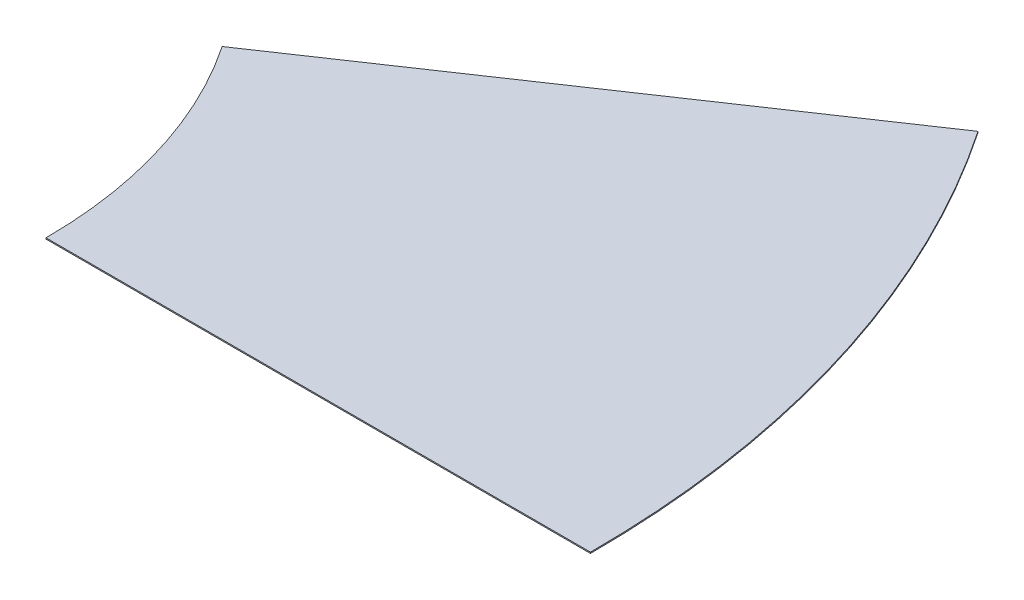
ISO-10303-21;
HEADER;
FILE_DESCRIPTION(('STEP AP214'),'2;1');
FILE_NAME('part.step','',(''),(''),'','','');
FILE_SCHEMA(('AUTOMOTIVE_DESIGN { 1 0 10303 214 1 1 1 1 }'));
ENDSEC;
DATA;
#1=APPLICATION_CONTEXT('core data for automotive mechanical design processes');
#2=APPLICATION_PROTOCOL_DEFINITION('international standard','automotive_design',2000,#1);
#3=PRODUCT_CONTEXT('',#1,'mechanical');
#4=PRODUCT('Part','Part','',(#3));
#5=PRODUCT_RELATED_PRODUCT_CATEGORY('part','',(#4));
#6=PRODUCT_DEFINITION_FORMATION('','',#4);
#7=PRODUCT_DEFINITION_CONTEXT('part definition',#1,'design');
#8=PRODUCT_DEFINITION('design','',#6,#7);
#9=PRODUCT_DEFINITION_SHAPE('','',#8);
#10=(LENGTH_UNIT() NAMED_UNIT(*) SI_UNIT(.MILLI.,.METRE.));
#11=(NAMED_UNIT(*) PLANE_ANGLE_UNIT() SI_UNIT($,.RADIAN.));
#12=(NAMED_UNIT(*) SI_UNIT($,.STERADIAN.) SOLID_ANGLE_UNIT());
#13=UNCERTAINTY_MEASURE_WITH_UNIT(LENGTH_MEASURE(1.E-05),#10,'distance_accuracy_value','');
#14=(GEOMETRIC_REPRESENTATION_CONTEXT(3) GLOBAL_UNCERTAINTY_ASSIGNED_CONTEXT((#13)) GLOBAL_UNIT_ASSIGNED_CONTEXT((#10,
#11,#12)) REPRESENTATION_CONTEXT('',''));
#15=CARTESIAN_POINT('',(0.,0.,0.));
#16=DIRECTION('',(0.,0.,1.));
#17=DIRECTION('',(1.,0.,0.));
#18=AXIS2_PLACEMENT_3D('',#15,#16,#17);
#19=CARTESIAN_POINT('',(0.,0.13,0.));
#20=DIRECTION('',(0.,-1.,0.));
#21=DIRECTION('',(0.,0.,-1.));
#22=AXIS2_PLACEMENT_3D('',#19,#20,#21);
#23=CYLINDRICAL_SURFACE('',#22,110.);
#24=CARTESIAN_POINT('',(0.,0.,0.));
#25=DIRECTION('',(0.,1.,0.));
#26=DIRECTION('',(0.,0.,1.));
#27=AXIS2_PLACEMENT_3D('',#24,#25,#26);
#28=CIRCLE('',#27,110.);
#29=CARTESIAN_POINT('',(110.,0.,0.));
#30=VERTEX_POINT('',#29);
#31=CARTESIAN_POINT('',(91.1941329810549,0.,-61.5112193817816));
#32=VERTEX_POINT('',#31);
#33=EDGE_CURVE('E97',#30,#32,#28,.T.);
#34=ORIENTED_EDGE('',*,*,#33,.T.);
#35=DIRECTION('',(0.,-1.,0.));
#36=VECTOR('',#35,1.);
#37=CARTESIAN_POINT('',(91.1941329810549,0.13,-61.5112193817816));
#38=LINE('',#37,#36);
#39=CARTESIAN_POINT('',(91.1941329810549,0.13,-61.5112193817816));
#40=VERTEX_POINT('',#39);
#41=EDGE_CURVE('E11',#40,#32,#38,.T.);
#42=ORIENTED_EDGE('',*,*,#41,.F.);
#43=CARTESIAN_POINT('',(0.,0.13,0.));
#44=DIRECTION('',(0.,1.,0.));
#45=DIRECTION('',(0.,0.,1.));
#46=AXIS2_PLACEMENT_3D('',#43,#44,#45);
#47=CIRCLE('',#46,110.);
#48=CARTESIAN_POINT('',(110.,0.13,0.));
#49=VERTEX_POINT('',#48);
#50=EDGE_CURVE('E83',#49,#40,#47,.T.);
#51=ORIENTED_EDGE('',*,*,#50,.F.);
#52=DIRECTION('',(0.,-1.,0.));
#53=VECTOR('',#52,1.);
#54=CARTESIAN_POINT('',(110.,0.13,0.));
#55=LINE('',#54,#53);
#56=EDGE_CURVE('E50',#49,#30,#55,.T.);
#57=ORIENTED_EDGE('',*,*,#56,.T.);
#58=EDGE_LOOP('',(#34,#42,#51,#57));
#59=FACE_BOUND('',#58,.T.);
#60=ADVANCED_FACE('F34',(#59),#23,.T.);
#61=CARTESIAN_POINT('',(91.1941329810549,0.13,-61.5112193817816));
#62=DIRECTION('',(0.559192903470742,0.,0.829037572555045));
#63=DIRECTION('',(0.829037572555045,0.,-0.559192903470742));
#64=AXIS2_PLACEMENT_3D('',#61,#62,#63);
#65=PLANE('',#64);
#66=DIRECTION('',(-0.829037572555045,0.,0.559192903470742));
#67=VECTOR('',#66,1.);
#68=CARTESIAN_POINT('',(91.1941329810549,0.,-61.5112193817816));
#69=LINE('',#68,#67);
#70=CARTESIAN_POINT('',(41.4518786277522,0.,-27.9596451735371));
#71=VERTEX_POINT('',#70);
#72=EDGE_CURVE('E88',#32,#71,#69,.T.);
#73=ORIENTED_EDGE('',*,*,#72,.T.);
#74=DIRECTION('',(0.,-1.,0.));
#75=VECTOR('',#74,1.);
#76=CARTESIAN_POINT('',(41.4518786277522,0.13,-27.9596451735371));
#77=LINE('',#76,#75);
#78=CARTESIAN_POINT('',(41.4518786277522,0.13,-27.9596451735371));
#79=VERTEX_POINT('',#78);
#80=EDGE_CURVE('E42',#79,#71,#77,.T.);
#81=ORIENTED_EDGE('',*,*,#80,.F.);
#82=DIRECTION('',(-0.829037572555045,0.,0.559192903470742));
#83=VECTOR('',#82,1.);
#84=CARTESIAN_POINT('',(91.1941329810549,0.13,-61.5112193817816));
#85=LINE('',#84,#83);
#86=EDGE_CURVE('E75',#40,#79,#85,.T.);
#87=ORIENTED_EDGE('',*,*,#86,.F.);
#88=ORIENTED_EDGE('',*,*,#41,.T.);
#89=EDGE_LOOP('',(#73,#81,#87,#88));
#90=FACE_BOUND('',#89,.T.);
#91=ADVANCED_FACE('F87',(#90),#65,.F.);
#92=CARTESIAN_POINT('',(0.,0.13,0.));
#93=DIRECTION('',(0.,-1.,0.));
#94=DIRECTION('',(0.,0.,-1.));
#95=AXIS2_PLACEMENT_3D('',#92,#93,#94);
#96=CYLINDRICAL_SURFACE('',#95,50.);
#97=CARTESIAN_POINT('',(0.,0.,0.));
#98=DIRECTION('',(0.,1.,0.));
#99=DIRECTION('',(0.,0.,1.));
#100=AXIS2_PLACEMENT_3D('',#97,#98,#99);
#101=CIRCLE('',#100,50.);
#102=CARTESIAN_POINT('',(50.,0.,0.));
#103=VERTEX_POINT('',#102);
#104=EDGE_CURVE('E100',#103,#71,#101,.T.);
#105=ORIENTED_EDGE('',*,*,#104,.F.);
#106=DIRECTION('',(0.,-1.,0.));
#107=VECTOR('',#106,1.);
#108=CARTESIAN_POINT('',(50.,0.13,0.));
#109=LINE('',#108,#107);
#110=CARTESIAN_POINT('',(50.,0.13,0.));
#111=VERTEX_POINT('',#110);
#112=EDGE_CURVE('E64',#111,#103,#109,.T.);
#113=ORIENTED_EDGE('',*,*,#112,.F.);
#114=CARTESIAN_POINT('',(0.,0.13,0.));
#115=DIRECTION('',(0.,1.,0.));
#116=DIRECTION('',(0.,0.,1.));
#117=AXIS2_PLACEMENT_3D('',#114,#115,#116);
#118=CIRCLE('',#117,50.);
#119=EDGE_CURVE('E82',#111,#79,#118,.T.);
#120=ORIENTED_EDGE('',*,*,#119,.T.);
#121=ORIENTED_EDGE('',*,*,#80,.T.);
#122=EDGE_LOOP('',(#105,#113,#120,#121));
#123=FACE_BOUND('',#122,.T.);
#124=ADVANCED_FACE('F91',(#123),#96,.F.);
#125=CARTESIAN_POINT('',(110.,0.13,0.));
#126=DIRECTION('',(0.,0.,1.));
#127=DIRECTION('',(1.,0.,0.));
#128=AXIS2_PLACEMENT_3D('',#125,#126,#127);
#129=PLANE('',#128);
#130=DIRECTION('',(-1.,0.,0.));
#131=VECTOR('',#130,1.);
#132=CARTESIAN_POINT('',(110.,0.,0.));
#133=LINE('',#132,#131);
#134=EDGE_CURVE('E102',#30,#103,#133,.T.);
#135=ORIENTED_EDGE('',*,*,#134,.F.);
#136=ORIENTED_EDGE('',*,*,#56,.F.);
#137=DIRECTION('',(-1.,0.,0.));
#138=VECTOR('',#137,1.);
#139=CARTESIAN_POINT('',(110.,0.13,0.));
#140=LINE('',#139,#138);
#141=EDGE_CURVE('E92',#49,#111,#140,.T.);
#142=ORIENTED_EDGE('',*,*,#141,.T.);
#143=ORIENTED_EDGE('',*,*,#112,.T.);
#144=EDGE_LOOP('',(#135,#136,#142,#143));
#145=FACE_BOUND('',#144,.T.);
#146=ADVANCED_FACE('F108',(#145),#129,.T.);
#147=CARTESIAN_POINT('',(0.,0.13,0.));
#148=DIRECTION('',(0.,1.,0.));
#149=DIRECTION('',(0.,0.,1.));
#150=AXIS2_PLACEMENT_3D('',#147,#148,#149);
#151=PLANE('',#150);
#152=ORIENTED_EDGE('',*,*,#50,.T.);
#153=ORIENTED_EDGE('',*,*,#86,.T.);
#154=ORIENTED_EDGE('',*,*,#119,.F.);
#155=ORIENTED_EDGE('',*,*,#141,.F.);
#156=EDGE_LOOP('',(#152,#153,#154,#155));
#157=FACE_BOUND('',#156,.T.);
#158=ADVANCED_FACE('F79',(#157),#151,.T.);
#159=CARTESIAN_POINT('',(0.,0.,0.));
#160=DIRECTION('',(0.,1.,0.));
#161=DIRECTION('',(0.,0.,1.));
#162=AXIS2_PLACEMENT_3D('',#159,#160,#161);
#163=PLANE('',#162);
#164=ORIENTED_EDGE('',*,*,#33,.F.);
#165=ORIENTED_EDGE('',*,*,#134,.T.);
#166=ORIENTED_EDGE('',*,*,#104,.T.);
#167=ORIENTED_EDGE('',*,*,#72,.F.);
#168=EDGE_LOOP('',(#164,#165,#166,#167));
#169=FACE_BOUND('',#168,.T.);
#170=ADVANCED_FACE('F107',(#169),#163,.F.);
#171=CLOSED_SHELL('',(#60,#91,#124,#146,#158,#170));
#172=MANIFOLD_SOLID_BREP('B2',#171);
#173=ADVANCED_BREP_SHAPE_REPRESENTATION('',(#18,#172),#14);
#174=SHAPE_DEFINITION_REPRESENTATION(#9,#173);
ENDSEC;
END-ISO-10303-21;
